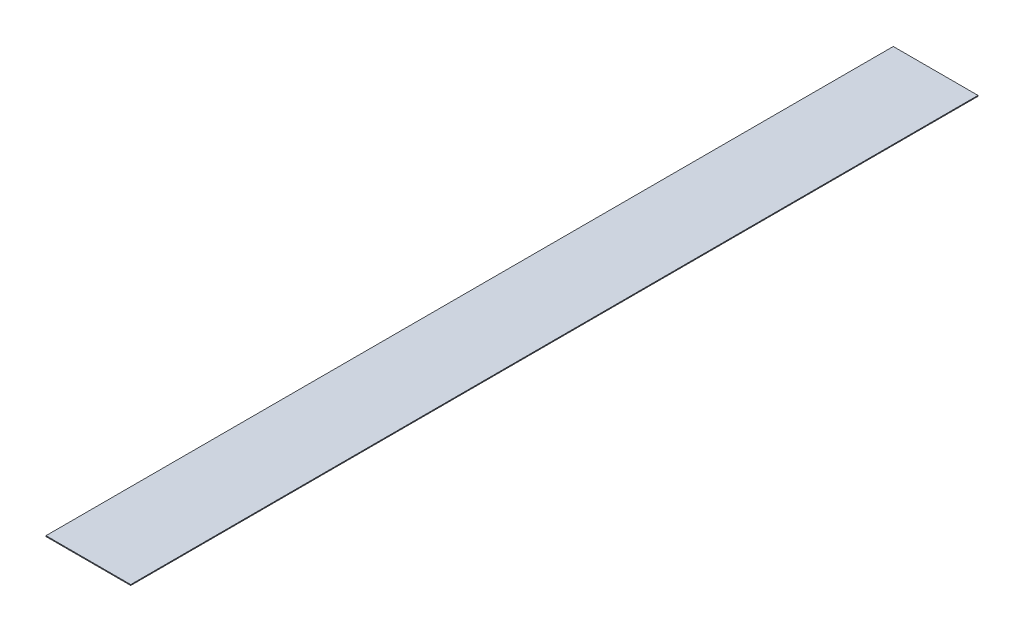
ISO-10303-21;
HEADER;
FILE_DESCRIPTION(('STEP AP214'),'2;1');
FILE_NAME('part.step','',(''),(''),'','','');
FILE_SCHEMA(('AUTOMOTIVE_DESIGN { 1 0 10303 214 1 1 1 1 }'));
ENDSEC;
DATA;
#1=APPLICATION_CONTEXT('core data for automotive mechanical design processes');
#2=APPLICATION_PROTOCOL_DEFINITION('international standard','automotive_design',2000,#1);
#3=PRODUCT_CONTEXT('',#1,'mechanical');
#4=PRODUCT('Part','Part','',(#3));
#5=PRODUCT_RELATED_PRODUCT_CATEGORY('part','',(#4));
#6=PRODUCT_DEFINITION_FORMATION('','',#4);
#7=PRODUCT_DEFINITION_CONTEXT('part definition',#1,'design');
#8=PRODUCT_DEFINITION('design','',#6,#7);
#9=PRODUCT_DEFINITION_SHAPE('','',#8);
#10=(LENGTH_UNIT() NAMED_UNIT(*) SI_UNIT(.MILLI.,.METRE.));
#11=(NAMED_UNIT(*) PLANE_ANGLE_UNIT() SI_UNIT($,.RADIAN.));
#12=(NAMED_UNIT(*) SI_UNIT($,.STERADIAN.) SOLID_ANGLE_UNIT());
#13=UNCERTAINTY_MEASURE_WITH_UNIT(LENGTH_MEASURE(1.E-05),#10,'distance_accuracy_value','');
#14=(GEOMETRIC_REPRESENTATION_CONTEXT(3) GLOBAL_UNCERTAINTY_ASSIGNED_CONTEXT((#13)) GLOBAL_UNIT_ASSIGNED_CONTEXT((#10,
#11,#12)) REPRESENTATION_CONTEXT('',''));
#15=CARTESIAN_POINT('',(0.,0.,0.));
#16=DIRECTION('',(0.,0.,1.));
#17=DIRECTION('',(1.,0.,0.));
#18=AXIS2_PLACEMENT_3D('',#15,#16,#17);
#19=CARTESIAN_POINT('',(0.,10.,0.));
#20=DIRECTION('',(1.,0.,0.));
#21=DIRECTION('',(0.,0.,-1.));
#22=AXIS2_PLACEMENT_3D('',#19,#20,#21);
#23=PLANE('',#22);
#24=DIRECTION('',(0.,0.,1.));
#25=VECTOR('',#24,1.);
#26=CARTESIAN_POINT('',(0.,0.,0.));
#27=LINE('',#26,#25);
#28=CARTESIAN_POINT('',(0.,0.,-10000.));
#29=VERTEX_POINT('',#28);
#30=CARTESIAN_POINT('',(0.,0.,0.));
#31=VERTEX_POINT('',#30);
#32=EDGE_CURVE('E96',#29,#31,#27,.T.);
#33=ORIENTED_EDGE('',*,*,#32,.T.);
#34=DIRECTION('',(0.,-1.,0.));
#35=VECTOR('',#34,1.);
#36=CARTESIAN_POINT('',(0.,10.,0.));
#37=LINE('',#36,#35);
#38=CARTESIAN_POINT('',(0.,10.,0.));
#39=VERTEX_POINT('',#38);
#40=EDGE_CURVE('E11',#39,#31,#37,.T.);
#41=ORIENTED_EDGE('',*,*,#40,.F.);
#42=DIRECTION('',(0.,0.,1.));
#43=VECTOR('',#42,1.);
#44=CARTESIAN_POINT('',(0.,10.,0.));
#45=LINE('',#44,#43);
#46=CARTESIAN_POINT('',(0.,10.,-10000.));
#47=VERTEX_POINT('',#46);
#48=EDGE_CURVE('E84',#47,#39,#45,.T.);
#49=ORIENTED_EDGE('',*,*,#48,.F.);
#50=DIRECTION('',(0.,-1.,0.));
#51=VECTOR('',#50,1.);
#52=CARTESIAN_POINT('',(0.,10.,-10000.));
#53=LINE('',#52,#51);
#54=EDGE_CURVE('E92',#47,#29,#53,.T.);
#55=ORIENTED_EDGE('',*,*,#54,.T.);
#56=EDGE_LOOP('',(#33,#41,#49,#55));
#57=FACE_BOUND('',#56,.T.);
#58=ADVANCED_FACE('F33',(#57),#23,.F.);
#59=CARTESIAN_POINT('',(0.,10.,0.));
#60=DIRECTION('',(0.,0.,-1.));
#61=DIRECTION('',(-1.,0.,0.));
#62=AXIS2_PLACEMENT_3D('',#59,#60,#61);
#63=PLANE('',#62);
#64=DIRECTION('',(1.,0.,0.));
#65=VECTOR('',#64,1.);
#66=CARTESIAN_POINT('',(0.,0.,0.));
#67=LINE('',#66,#65);
#68=CARTESIAN_POINT('',(1000.,0.,0.));
#69=VERTEX_POINT('',#68);
#70=EDGE_CURVE('E88',#31,#69,#67,.T.);
#71=ORIENTED_EDGE('',*,*,#70,.T.);
#72=DIRECTION('',(0.,-1.,0.));
#73=VECTOR('',#72,1.);
#74=CARTESIAN_POINT('',(1000.,10.,0.));
#75=LINE('',#74,#73);
#76=CARTESIAN_POINT('',(1000.,10.,0.));
#77=VERTEX_POINT('',#76);
#78=EDGE_CURVE('E41',#77,#69,#75,.T.);
#79=ORIENTED_EDGE('',*,*,#78,.F.);
#80=DIRECTION('',(1.,0.,0.));
#81=VECTOR('',#80,1.);
#82=CARTESIAN_POINT('',(0.,10.,0.));
#83=LINE('',#82,#81);
#84=EDGE_CURVE('E79',#39,#77,#83,.T.);
#85=ORIENTED_EDGE('',*,*,#84,.F.);
#86=ORIENTED_EDGE('',*,*,#40,.T.);
#87=EDGE_LOOP('',(#71,#79,#85,#86));
#88=FACE_BOUND('',#87,.T.);
#89=ADVANCED_FACE('F87',(#88),#63,.F.);
#90=CARTESIAN_POINT('',(1000.,10.,0.));
#91=DIRECTION('',(-1.,0.,0.));
#92=DIRECTION('',(0.,0.,1.));
#93=AXIS2_PLACEMENT_3D('',#90,#91,#92);
#94=PLANE('',#93);
#95=DIRECTION('',(0.,0.,-1.));
#96=VECTOR('',#95,1.);
#97=CARTESIAN_POINT('',(1000.,0.,0.));
#98=LINE('',#97,#96);
#99=CARTESIAN_POINT('',(1000.,0.,-10000.));
#100=VERTEX_POINT('',#99);
#101=EDGE_CURVE('E66',#69,#100,#98,.T.);
#102=ORIENTED_EDGE('',*,*,#101,.T.);
#103=DIRECTION('',(0.,-1.,0.));
#104=VECTOR('',#103,1.);
#105=CARTESIAN_POINT('',(1000.,10.,-10000.));
#106=LINE('',#105,#104);
#107=CARTESIAN_POINT('',(1000.,10.,-10000.));
#108=VERTEX_POINT('',#107);
#109=EDGE_CURVE('E89',#108,#100,#106,.T.);
#110=ORIENTED_EDGE('',*,*,#109,.F.);
#111=DIRECTION('',(0.,0.,-1.));
#112=VECTOR('',#111,1.);
#113=CARTESIAN_POINT('',(1000.,10.,0.));
#114=LINE('',#113,#112);
#115=EDGE_CURVE('E82',#77,#108,#114,.T.);
#116=ORIENTED_EDGE('',*,*,#115,.F.);
#117=ORIENTED_EDGE('',*,*,#78,.T.);
#118=EDGE_LOOP('',(#102,#110,#116,#117));
#119=FACE_BOUND('',#118,.T.);
#120=ADVANCED_FACE('F90',(#119),#94,.F.);
#121=CARTESIAN_POINT('',(0.,10.,-10000.));
#122=DIRECTION('',(0.,0.,1.));
#123=DIRECTION('',(1.,0.,0.));
#124=AXIS2_PLACEMENT_3D('',#121,#122,#123);
#125=PLANE('',#124);
#126=DIRECTION('',(-1.,0.,0.));
#127=VECTOR('',#126,1.);
#128=CARTESIAN_POINT('',(0.,0.,-10000.));
#129=LINE('',#128,#127);
#130=EDGE_CURVE('E72',#100,#29,#129,.T.);
#131=ORIENTED_EDGE('',*,*,#130,.T.);
#132=ORIENTED_EDGE('',*,*,#54,.F.);
#133=DIRECTION('',(-1.,0.,0.));
#134=VECTOR('',#133,1.);
#135=CARTESIAN_POINT('',(0.,10.,-10000.));
#136=LINE('',#135,#134);
#137=EDGE_CURVE('E49',#108,#47,#136,.T.);
#138=ORIENTED_EDGE('',*,*,#137,.F.);
#139=ORIENTED_EDGE('',*,*,#109,.T.);
#140=EDGE_LOOP('',(#131,#132,#138,#139));
#141=FACE_BOUND('',#140,.T.);
#142=ADVANCED_FACE('F103',(#141),#125,.F.);
#143=CARTESIAN_POINT('',(0.,10.,0.));
#144=DIRECTION('',(0.,-1.,0.));
#145=DIRECTION('',(0.,0.,-1.));
#146=AXIS2_PLACEMENT_3D('',#143,#144,#145);
#147=PLANE('',#146);
#148=ORIENTED_EDGE('',*,*,#48,.T.);
#149=ORIENTED_EDGE('',*,*,#84,.T.);
#150=ORIENTED_EDGE('',*,*,#115,.T.);
#151=ORIENTED_EDGE('',*,*,#137,.T.);
#152=EDGE_LOOP('',(#148,#149,#150,#151));
#153=FACE_BOUND('',#152,.T.);
#154=ADVANCED_FACE('F80',(#153),#147,.F.);
#155=CARTESIAN_POINT('',(0.,0.,0.));
#156=DIRECTION('',(0.,-1.,0.));
#157=DIRECTION('',(0.,0.,-1.));
#158=AXIS2_PLACEMENT_3D('',#155,#156,#157);
#159=PLANE('',#158);
#160=ORIENTED_EDGE('',*,*,#32,.F.);
#161=ORIENTED_EDGE('',*,*,#130,.F.);
#162=ORIENTED_EDGE('',*,*,#101,.F.);
#163=ORIENTED_EDGE('',*,*,#70,.F.);
#164=EDGE_LOOP('',(#160,#161,#162,#163));
#165=FACE_BOUND('',#164,.T.);
#166=ADVANCED_FACE('F106',(#165),#159,.T.);
#167=CLOSED_SHELL('',(#58,#89,#120,#142,#154,#166));
#168=MANIFOLD_SOLID_BREP('B2',#167);
#169=ADVANCED_BREP_SHAPE_REPRESENTATION('',(#18,#168),#14);
#170=SHAPE_DEFINITION_REPRESENTATION(#9,#169);
ENDSEC;
END-ISO-10303-21;
